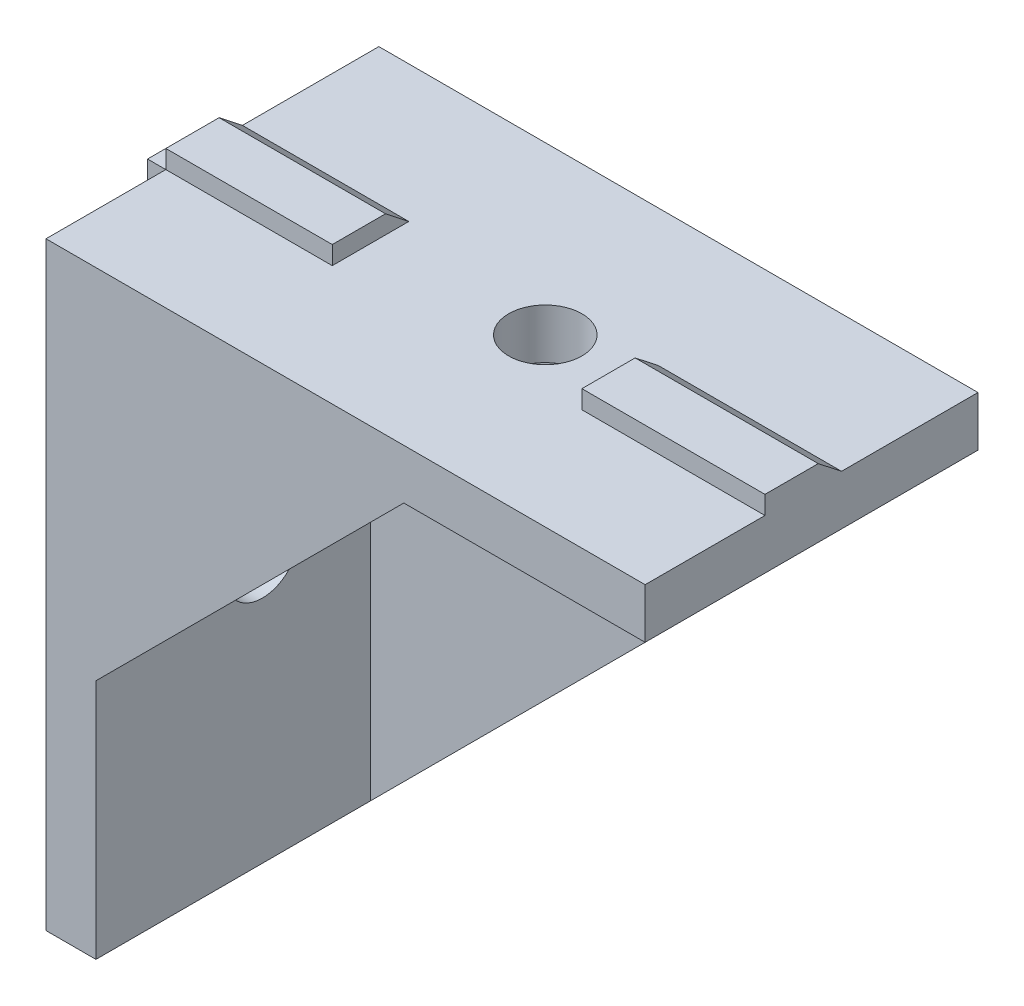
ISO-10303-21;
HEADER;
FILE_DESCRIPTION(('STEP AP214'),'2;1');
FILE_NAME('part.step','',(''),(''),'','','');
FILE_SCHEMA(('AUTOMOTIVE_DESIGN { 1 0 10303 214 1 1 1 1 }'));
ENDSEC;
DATA;
#1=APPLICATION_CONTEXT('core data for automotive mechanical design processes');
#2=APPLICATION_PROTOCOL_DEFINITION('international standard','automotive_design',2000,#1);
#3=PRODUCT_CONTEXT('',#1,'mechanical');
#4=PRODUCT('Part','Part','',(#3));
#5=PRODUCT_RELATED_PRODUCT_CATEGORY('part','',(#4));
#6=PRODUCT_DEFINITION_FORMATION('','',#4);
#7=PRODUCT_DEFINITION_CONTEXT('part definition',#1,'design');
#8=PRODUCT_DEFINITION('design','',#6,#7);
#9=PRODUCT_DEFINITION_SHAPE('','',#8);
#10=(LENGTH_UNIT() NAMED_UNIT(*) SI_UNIT(.MILLI.,.METRE.));
#11=(NAMED_UNIT(*) PLANE_ANGLE_UNIT() SI_UNIT($,.RADIAN.));
#12=(NAMED_UNIT(*) SI_UNIT($,.STERADIAN.) SOLID_ANGLE_UNIT());
#13=UNCERTAINTY_MEASURE_WITH_UNIT(LENGTH_MEASURE(1.E-05),#10,'distance_accuracy_value','');
#14=(GEOMETRIC_REPRESENTATION_CONTEXT(3) GLOBAL_UNCERTAINTY_ASSIGNED_CONTEXT((#13)) GLOBAL_UNIT_ASSIGNED_CONTEXT((#10,
#11,#12)) REPRESENTATION_CONTEXT('',''));
#15=CARTESIAN_POINT('',(0.,0.,0.));
#16=DIRECTION('',(0.,0.,1.));
#17=DIRECTION('',(1.,0.,0.));
#18=AXIS2_PLACEMENT_3D('',#15,#16,#17);
#19=CARTESIAN_POINT('',(3.,-3.,20.));
#20=DIRECTION('',(-1.,0.,0.));
#21=DIRECTION('',(0.,0.,1.));
#22=AXIS2_PLACEMENT_3D('',#19,#20,#21);
#23=PLANE('',#22);
#24=CARTESIAN_POINT('',(3.,-20.,10.));
#25=DIRECTION('',(1.,0.,0.));
#26=DIRECTION('',(0.,0.,-1.));
#27=AXIS2_PLACEMENT_3D('',#24,#25,#26);
#28=CIRCLE('',#27,2.2);
#29=CARTESIAN_POINT('',(3.,-20.,7.8));
#30=VERTEX_POINT('',#29);
#31=EDGE_CURVE('E282',#30,#30,#28,.T.);
#32=ORIENTED_EDGE('',*,*,#31,.F.);
#33=EDGE_LOOP('',(#32));
#34=FACE_BOUND('',#33,.T.);
#35=DIRECTION('',(0.,0.908676843963313,-0.417500171550712));
#36=VECTOR('',#35,1.);
#37=CARTESIAN_POINT('',(3.,-21.5,17.5));
#38=LINE('',#37,#36);
#39=CARTESIAN_POINT('',(3.,-21.5,17.5));
#40=VERTEX_POINT('',#39);
#41=CARTESIAN_POINT('',(3.,-3.,9.));
#42=VERTEX_POINT('',#41);
#43=EDGE_CURVE('E549',#40,#42,#38,.T.);
#44=ORIENTED_EDGE('',*,*,#43,.F.);
#45=DIRECTION('',(0.,0.,1.));
#46=VECTOR('',#45,1.);
#47=CARTESIAN_POINT('',(3.,-21.5,17.5));
#48=LINE('',#47,#46);
#49=CARTESIAN_POINT('',(3.,-21.5,20.));
#50=VERTEX_POINT('',#49);
#51=EDGE_CURVE('E583',#40,#50,#48,.T.);
#52=ORIENTED_EDGE('',*,*,#51,.T.);
#53=DIRECTION('',(0.,1.,0.));
#54=VECTOR('',#53,1.);
#55=CARTESIAN_POINT('',(3.,-3.,20.));
#56=LINE('',#55,#54);
#57=CARTESIAN_POINT('',(3.,-36.,20.));
#58=VERTEX_POINT('',#57);
#59=EDGE_CURVE('E591',#58,#50,#56,.T.);
#60=ORIENTED_EDGE('',*,*,#59,.F.);
#61=DIRECTION('',(0.,0.,-1.));
#62=VECTOR('',#61,1.);
#63=CARTESIAN_POINT('',(3.,-36.,20.));
#64=LINE('',#63,#62);
#65=CARTESIAN_POINT('',(3.,-36.,3.5));
#66=VERTEX_POINT('',#65);
#67=EDGE_CURVE('E240',#58,#66,#64,.T.);
#68=ORIENTED_EDGE('',*,*,#67,.T.);
#69=DIRECTION('',(0.,1.,0.));
#70=VECTOR('',#69,1.);
#71=CARTESIAN_POINT('',(3.,-3.,3.5));
#72=LINE('',#71,#70);
#73=CARTESIAN_POINT('',(3.,-3.,3.5));
#74=VERTEX_POINT('',#73);
#75=EDGE_CURVE('E228',#66,#74,#72,.T.);
#76=ORIENTED_EDGE('',*,*,#75,.T.);
#77=DIRECTION('',(0.,0.,-1.));
#78=VECTOR('',#77,1.);
#79=CARTESIAN_POINT('',(3.,-3.,20.));
#80=LINE('',#79,#78);
#81=EDGE_CURVE('E238',#42,#74,#80,.T.);
#82=ORIENTED_EDGE('',*,*,#81,.F.);
#83=EDGE_LOOP('',(#44,#52,#60,#68,#76,#82));
#84=FACE_BOUND('',#83,.T.);
#85=ADVANCED_FACE('F36',(#34,#84),#23,.F.);
#86=CARTESIAN_POINT('',(36.,-3.,20.));
#87=DIRECTION('',(0.,1.,0.));
#88=DIRECTION('',(0.,0.,1.));
#89=AXIS2_PLACEMENT_3D('',#86,#87,#88);
#90=PLANE('',#89);
#91=CARTESIAN_POINT('',(20.,-3.,10.));
#92=DIRECTION('',(0.,-1.,0.));
#93=DIRECTION('',(0.,0.,-1.));
#94=AXIS2_PLACEMENT_3D('',#91,#92,#93);
#95=CIRCLE('',#94,2.2);
#96=CARTESIAN_POINT('',(20.,-3.,7.8));
#97=VERTEX_POINT('',#96);
#98=EDGE_CURVE('E597',#97,#97,#95,.T.);
#99=ORIENTED_EDGE('',*,*,#98,.F.);
#100=EDGE_LOOP('',(#99));
#101=FACE_BOUND('',#100,.T.);
#102=DIRECTION('',(0.908676843963313,0.,0.417500171550712));
#103=VECTOR('',#102,1.);
#104=CARTESIAN_POINT('',(3.,-3.,9.));
#105=LINE('',#104,#103);
#106=CARTESIAN_POINT('',(21.5,-3.,17.5));
#107=VERTEX_POINT('',#106);
#108=EDGE_CURVE('E567',#42,#107,#105,.T.);
#109=ORIENTED_EDGE('',*,*,#108,.F.);
#110=ORIENTED_EDGE('',*,*,#81,.T.);
#111=DIRECTION('',(1.,0.,0.));
#112=VECTOR('',#111,1.);
#113=CARTESIAN_POINT('',(36.,-3.,3.5));
#114=LINE('',#113,#112);
#115=CARTESIAN_POINT('',(36.,-3.,3.5));
#116=VERTEX_POINT('',#115);
#117=EDGE_CURVE('E231',#74,#116,#114,.T.);
#118=ORIENTED_EDGE('',*,*,#117,.T.);
#119=DIRECTION('',(0.,0.,-1.));
#120=VECTOR('',#119,1.);
#121=CARTESIAN_POINT('',(36.,-3.,20.));
#122=LINE('',#121,#120);
#123=CARTESIAN_POINT('',(36.,-3.,20.));
#124=VERTEX_POINT('',#123);
#125=EDGE_CURVE('E206',#124,#116,#122,.T.);
#126=ORIENTED_EDGE('',*,*,#125,.F.);
#127=DIRECTION('',(1.,0.,0.));
#128=VECTOR('',#127,1.);
#129=CARTESIAN_POINT('',(36.,-3.,20.));
#130=LINE('',#129,#128);
#131=CARTESIAN_POINT('',(21.5,-3.,20.));
#132=VERTEX_POINT('',#131);
#133=EDGE_CURVE('E224',#132,#124,#130,.T.);
#134=ORIENTED_EDGE('',*,*,#133,.F.);
#135=DIRECTION('',(0.,0.,1.));
#136=VECTOR('',#135,1.);
#137=CARTESIAN_POINT('',(21.5,-3.,17.5));
#138=LINE('',#137,#136);
#139=EDGE_CURVE('E232',#107,#132,#138,.T.);
#140=ORIENTED_EDGE('',*,*,#139,.F.);
#141=EDGE_LOOP('',(#109,#110,#118,#126,#134,#140));
#142=FACE_BOUND('',#141,.T.);
#143=ADVANCED_FACE('F421',(#101,#142),#90,.F.);
#144=CARTESIAN_POINT('',(-1.1,4.72969343615419,9.6));
#145=DIRECTION('',(-0.786318338822423,0.,-0.617821551931904));
#146=DIRECTION('',(-0.617821551931904,0.,0.786318338822423));
#147=AXIS2_PLACEMENT_3D('',#144,#145,#146);
#148=PLANE('',#147);
#149=DIRECTION('',(-0.617821551931904,0.,0.786318338822423));
#150=VECTOR('',#149,1.);
#151=CARTESIAN_POINT('',(-1.1,-25.,9.6));
#152=LINE('',#151,#150);
#153=CARTESIAN_POINT('',(0.,-25.,8.19999999999999));
#154=VERTEX_POINT('',#153);
#155=CARTESIAN_POINT('',(-1.1,-25.,9.6));
#156=VERTEX_POINT('',#155);
#157=EDGE_CURVE('E558',#154,#156,#152,.T.);
#158=ORIENTED_EDGE('',*,*,#157,.F.);
#159=DIRECTION('',(0.,-1.,0.));
#160=VECTOR('',#159,1.);
#161=CARTESIAN_POINT('',(0.,4.72969343615419,8.2));
#162=LINE('',#161,#160);
#163=CARTESIAN_POINT('',(0.,-36.,8.2));
#164=VERTEX_POINT('',#163);
#165=EDGE_CURVE('E11',#154,#164,#162,.T.);
#166=ORIENTED_EDGE('',*,*,#165,.T.);
#167=DIRECTION('',(0.617821551931904,0.,-0.786318338822423));
#168=VECTOR('',#167,1.);
#169=CARTESIAN_POINT('',(-1.1,-36.,9.6));
#170=LINE('',#169,#168);
#171=CARTESIAN_POINT('',(-1.1,-36.,9.6));
#172=VERTEX_POINT('',#171);
#173=EDGE_CURVE('E385',#172,#164,#170,.T.);
#174=ORIENTED_EDGE('',*,*,#173,.F.);
#175=DIRECTION('',(0.,-1.,0.));
#176=VECTOR('',#175,1.);
#177=CARTESIAN_POINT('',(-1.1,4.72969343615419,9.6));
#178=LINE('',#177,#176);
#179=EDGE_CURVE('E389',#156,#172,#178,.T.);
#180=ORIENTED_EDGE('',*,*,#179,.F.);
#181=EDGE_LOOP('',(#158,#166,#174,#180));
#182=FACE_BOUND('',#181,.T.);
#183=ADVANCED_FACE('F411',(#182),#148,.T.);
#184=CARTESIAN_POINT('',(-1.1,4.72969343615419,12.8));
#185=DIRECTION('',(-1.,0.,0.));
#186=DIRECTION('',(0.,0.,1.));
#187=AXIS2_PLACEMENT_3D('',#184,#185,#186);
#188=PLANE('',#187);
#189=DIRECTION('',(0.,0.,1.));
#190=VECTOR('',#189,1.);
#191=CARTESIAN_POINT('',(-1.1,-25.,-2.50000000007189E-05));
#192=LINE('',#191,#190);
#193=CARTESIAN_POINT('',(-1.1,-25.,12.8));
#194=VERTEX_POINT('',#193);
#195=EDGE_CURVE('E409',#156,#194,#192,.T.);
#196=ORIENTED_EDGE('',*,*,#195,.F.);
#197=ORIENTED_EDGE('',*,*,#179,.T.);
#198=DIRECTION('',(0.,0.,-1.));
#199=VECTOR('',#198,1.);
#200=CARTESIAN_POINT('',(-1.1,-36.,12.8));
#201=LINE('',#200,#199);
#202=CARTESIAN_POINT('',(-1.1,-36.,12.8));
#203=VERTEX_POINT('',#202);
#204=EDGE_CURVE('E377',#203,#172,#201,.T.);
#205=ORIENTED_EDGE('',*,*,#204,.F.);
#206=DIRECTION('',(0.,-1.,0.));
#207=VECTOR('',#206,1.);
#208=CARTESIAN_POINT('',(-1.1,4.72969343615419,12.8));
#209=LINE('',#208,#207);
#210=EDGE_CURVE('E363',#194,#203,#209,.T.);
#211=ORIENTED_EDGE('',*,*,#210,.F.);
#212=EDGE_LOOP('',(#196,#197,#205,#211));
#213=FACE_BOUND('',#212,.T.);
#214=ADVANCED_FACE('F408',(#213),#188,.T.);
#215=CARTESIAN_POINT('',(0.,4.72969343615419,12.8));
#216=DIRECTION('',(0.,0.,1.));
#217=DIRECTION('',(1.,0.,0.));
#218=AXIS2_PLACEMENT_3D('',#215,#216,#217);
#219=PLANE('',#218);
#220=DIRECTION('',(1.,0.,0.));
#221=VECTOR('',#220,1.);
#222=CARTESIAN_POINT('',(0.,-25.,12.8));
#223=LINE('',#222,#221);
#224=CARTESIAN_POINT('',(0.,-25.,12.8));
#225=VERTEX_POINT('',#224);
#226=EDGE_CURVE('E407',#194,#225,#223,.T.);
#227=ORIENTED_EDGE('',*,*,#226,.F.);
#228=ORIENTED_EDGE('',*,*,#210,.T.);
#229=DIRECTION('',(-1.,0.,0.));
#230=VECTOR('',#229,1.);
#231=CARTESIAN_POINT('',(0.,-36.,12.8));
#232=LINE('',#231,#230);
#233=CARTESIAN_POINT('',(0.,-36.,12.8));
#234=VERTEX_POINT('',#233);
#235=EDGE_CURVE('E365',#234,#203,#232,.T.);
#236=ORIENTED_EDGE('',*,*,#235,.F.);
#237=DIRECTION('',(0.,-1.,0.));
#238=VECTOR('',#237,1.);
#239=CARTESIAN_POINT('',(0.,4.72969343615419,12.8));
#240=LINE('',#239,#238);
#241=EDGE_CURVE('E364',#225,#234,#240,.T.);
#242=ORIENTED_EDGE('',*,*,#241,.F.);
#243=EDGE_LOOP('',(#227,#228,#236,#242));
#244=FACE_BOUND('',#243,.T.);
#245=ADVANCED_FACE('F405',(#244),#219,.T.);
#246=CARTESIAN_POINT('',(0.,-36.,3.5));
#247=DIRECTION('',(1.,0.,0.));
#248=DIRECTION('',(0.,0.,-1.));
#249=AXIS2_PLACEMENT_3D('',#246,#247,#248);
#250=PLANE('',#249);
#251=DIRECTION('',(0.,0.,-1.));
#252=VECTOR('',#251,1.);
#253=CARTESIAN_POINT('',(0.,0.,8.2));
#254=LINE('',#253,#252);
#255=CARTESIAN_POINT('',(0.,0.,12.8));
#256=VERTEX_POINT('',#255);
#257=CARTESIAN_POINT('',(0.,0.,8.2));
#258=VERTEX_POINT('',#257);
#259=EDGE_CURVE('E340',#256,#258,#254,.T.);
#260=ORIENTED_EDGE('',*,*,#259,.F.);
#261=DIRECTION('',(0.,-1.,0.));
#262=VECTOR('',#261,1.);
#263=CARTESIAN_POINT('',(0.,0.,12.8));
#264=LINE('',#263,#262);
#265=CARTESIAN_POINT('',(0.,1.1,12.8));
#266=VERTEX_POINT('',#265);
#267=EDGE_CURVE('E285',#266,#256,#264,.T.);
#268=ORIENTED_EDGE('',*,*,#267,.F.);
#269=DIRECTION('',(0.,0.,1.));
#270=VECTOR('',#269,1.);
#271=CARTESIAN_POINT('',(0.,1.1,12.8));
#272=LINE('',#271,#270);
#273=CARTESIAN_POINT('',(0.,1.1,9.6));
#274=VERTEX_POINT('',#273);
#275=EDGE_CURVE('E289',#274,#266,#272,.T.);
#276=ORIENTED_EDGE('',*,*,#275,.F.);
#277=DIRECTION('',(0.,0.617821551931903,0.786318338822423));
#278=VECTOR('',#277,1.);
#279=CARTESIAN_POINT('',(0.,1.1,9.6));
#280=LINE('',#279,#278);
#281=EDGE_CURVE('E295',#258,#274,#280,.T.);
#282=ORIENTED_EDGE('',*,*,#281,.F.);
#283=EDGE_LOOP('',(#260,#268,#276,#282));
#284=FACE_BOUND('',#283,.T.);
#285=ADVANCED_FACE('F418',(#284),#250,.F.);
#286=CARTESIAN_POINT('',(0.,0.,12.8));
#287=DIRECTION('',(0.,0.,1.));
#288=DIRECTION('',(1.,0.,0.));
#289=AXIS2_PLACEMENT_3D('',#286,#287,#288);
#290=PLANE('',#289);
#291=DIRECTION('',(0.,1.,0.));
#292=VECTOR('',#291,1.);
#293=CARTESIAN_POINT('',(25.,1.1,12.8));
#294=LINE('',#293,#292);
#295=CARTESIAN_POINT('',(25.,0.,12.8));
#296=VERTEX_POINT('',#295);
#297=CARTESIAN_POINT('',(25.,1.1,12.8));
#298=VERTEX_POINT('',#297);
#299=EDGE_CURVE('E338',#296,#298,#294,.T.);
#300=ORIENTED_EDGE('',*,*,#299,.F.);
#301=DIRECTION('',(1.,0.,0.));
#302=VECTOR('',#301,1.);
#303=CARTESIAN_POINT('',(0.,0.,12.8));
#304=LINE('',#303,#302);
#305=CARTESIAN_POINT('',(36.,0.,12.8));
#306=VERTEX_POINT('',#305);
#307=EDGE_CURVE('E266',#296,#306,#304,.T.);
#308=ORIENTED_EDGE('',*,*,#307,.T.);
#309=DIRECTION('',(0.,-1.,0.));
#310=VECTOR('',#309,1.);
#311=CARTESIAN_POINT('',(36.,0.,12.8));
#312=LINE('',#311,#310);
#313=CARTESIAN_POINT('',(36.,1.1,12.8));
#314=VERTEX_POINT('',#313);
#315=EDGE_CURVE('E292',#314,#306,#312,.T.);
#316=ORIENTED_EDGE('',*,*,#315,.F.);
#317=DIRECTION('',(1.,0.,0.));
#318=VECTOR('',#317,1.);
#319=CARTESIAN_POINT('',(0.,1.1,12.8));
#320=LINE('',#319,#318);
#321=EDGE_CURVE('E497',#298,#314,#320,.T.);
#322=ORIENTED_EDGE('',*,*,#321,.F.);
#323=EDGE_LOOP('',(#300,#308,#316,#322));
#324=FACE_BOUND('',#323,.T.);
#325=ADVANCED_FACE('F496',(#324),#290,.T.);
#326=CARTESIAN_POINT('',(0.,1.1,12.8));
#327=DIRECTION('',(0.,1.,0.));
#328=DIRECTION('',(0.,0.,1.));
#329=AXIS2_PLACEMENT_3D('',#326,#327,#328);
#330=PLANE('',#329);
#331=DIRECTION('',(0.,0.,1.));
#332=VECTOR('',#331,1.);
#333=CARTESIAN_POINT('',(25.,1.1,-2.50000000007189E-05));
#334=LINE('',#333,#332);
#335=CARTESIAN_POINT('',(25.,1.1,9.6));
#336=VERTEX_POINT('',#335);
#337=EDGE_CURVE('E325',#336,#298,#334,.T.);
#338=ORIENTED_EDGE('',*,*,#337,.T.);
#339=ORIENTED_EDGE('',*,*,#321,.T.);
#340=DIRECTION('',(0.,0.,1.));
#341=VECTOR('',#340,1.);
#342=CARTESIAN_POINT('',(36.,1.1,12.8));
#343=LINE('',#342,#341);
#344=CARTESIAN_POINT('',(36.,1.1,9.6));
#345=VERTEX_POINT('',#344);
#346=EDGE_CURVE('E275',#345,#314,#343,.T.);
#347=ORIENTED_EDGE('',*,*,#346,.F.);
#348=DIRECTION('',(1.,0.,0.));
#349=VECTOR('',#348,1.);
#350=CARTESIAN_POINT('',(0.,1.1,9.6));
#351=LINE('',#350,#349);
#352=EDGE_CURVE('E311',#336,#345,#351,.T.);
#353=ORIENTED_EDGE('',*,*,#352,.F.);
#354=EDGE_LOOP('',(#338,#339,#347,#353));
#355=FACE_BOUND('',#354,.T.);
#356=ADVANCED_FACE('F513',(#355),#330,.T.);
#357=CARTESIAN_POINT('',(0.,1.1,9.6));
#358=DIRECTION('',(0.,0.786318338822423,-0.617821551931903));
#359=DIRECTION('',(0.,0.617821551931904,0.786318338822423));
#360=AXIS2_PLACEMENT_3D('',#357,#358,#359);
#361=PLANE('',#360);
#362=DIRECTION('',(0.,-0.617821551931904,-0.786318338822423));
#363=VECTOR('',#362,1.);
#364=CARTESIAN_POINT('',(25.,1.1,9.6));
#365=LINE('',#364,#363);
#366=CARTESIAN_POINT('',(25.,0.,8.2));
#367=VERTEX_POINT('',#366);
#368=EDGE_CURVE('E46',#336,#367,#365,.T.);
#369=ORIENTED_EDGE('',*,*,#368,.F.);
#370=ORIENTED_EDGE('',*,*,#352,.T.);
#371=DIRECTION('',(0.,0.617821551931903,0.786318338822423));
#372=VECTOR('',#371,1.);
#373=CARTESIAN_POINT('',(36.,1.1,9.6));
#374=LINE('',#373,#372);
#375=CARTESIAN_POINT('',(36.,0.,8.2));
#376=VERTEX_POINT('',#375);
#377=EDGE_CURVE('E335',#376,#345,#374,.T.);
#378=ORIENTED_EDGE('',*,*,#377,.F.);
#379=DIRECTION('',(1.,0.,0.));
#380=VECTOR('',#379,1.);
#381=CARTESIAN_POINT('',(0.,0.,8.2));
#382=LINE('',#381,#380);
#383=EDGE_CURVE('E298',#367,#376,#382,.T.);
#384=ORIENTED_EDGE('',*,*,#383,.F.);
#385=EDGE_LOOP('',(#369,#370,#378,#384));
#386=FACE_BOUND('',#385,.T.);
#387=ADVANCED_FACE('F442',(#386),#361,.T.);
#388=CARTESIAN_POINT('',(0.,0.,3.5));
#389=DIRECTION('',(0.,0.,-1.));
#390=DIRECTION('',(-1.,0.,0.));
#391=AXIS2_PLACEMENT_3D('',#388,#389,#390);
#392=PLANE('',#391);
#393=ORIENTED_EDGE('',*,*,#117,.F.);
#394=ORIENTED_EDGE('',*,*,#75,.F.);
#395=DIRECTION('',(0.707106781186547,0.707106781186547,0.));
#396=VECTOR('',#395,1.);
#397=CARTESIAN_POINT('',(36.,-3.,3.5));
#398=LINE('',#397,#396);
#399=EDGE_CURVE('E244',#66,#116,#398,.T.);
#400=ORIENTED_EDGE('',*,*,#399,.T.);
#401=EDGE_LOOP('',(#393,#394,#400));
#402=FACE_BOUND('',#401,.T.);
#403=ADVANCED_FACE('F439',(#402),#392,.F.);
#404=CARTESIAN_POINT('',(3.,-36.,3.5));
#405=DIRECTION('',(0.,1.,0.));
#406=DIRECTION('',(0.,0.,1.));
#407=AXIS2_PLACEMENT_3D('',#404,#405,#406);
#408=PLANE('',#407);
#409=DIRECTION('',(1.,0.,0.));
#410=VECTOR('',#409,1.);
#411=CARTESIAN_POINT('',(3.,-36.,0.));
#412=LINE('',#411,#410);
#413=CARTESIAN_POINT('',(0.,-36.,0.));
#414=VERTEX_POINT('',#413);
#415=CARTESIAN_POINT('',(3.,-36.,0.));
#416=VERTEX_POINT('',#415);
#417=EDGE_CURVE('E243',#414,#416,#412,.T.);
#418=ORIENTED_EDGE('',*,*,#417,.T.);
#419=DIRECTION('',(0.,0.,-1.));
#420=VECTOR('',#419,1.);
#421=CARTESIAN_POINT('',(3.,-36.,3.5));
#422=LINE('',#421,#420);
#423=EDGE_CURVE('E301',#66,#416,#422,.T.);
#424=ORIENTED_EDGE('',*,*,#423,.F.);
#425=ORIENTED_EDGE('',*,*,#67,.F.);
#426=DIRECTION('',(1.,0.,0.));
#427=VECTOR('',#426,1.);
#428=CARTESIAN_POINT('',(3.,-36.,20.));
#429=LINE('',#428,#427);
#430=CARTESIAN_POINT('',(0.,-36.,20.));
#431=VERTEX_POINT('',#430);
#432=EDGE_CURVE('E235',#431,#58,#429,.T.);
#433=ORIENTED_EDGE('',*,*,#432,.F.);
#434=DIRECTION('',(0.,0.,-1.));
#435=VECTOR('',#434,1.);
#436=CARTESIAN_POINT('',(0.,-36.,3.5));
#437=LINE('',#436,#435);
#438=EDGE_CURVE('E61',#431,#234,#437,.T.);
#439=ORIENTED_EDGE('',*,*,#438,.T.);
#440=ORIENTED_EDGE('',*,*,#235,.T.);
#441=ORIENTED_EDGE('',*,*,#204,.T.);
#442=ORIENTED_EDGE('',*,*,#173,.T.);
#443=EDGE_CURVE('E246',#164,#414,#437,.T.);
#444=ORIENTED_EDGE('',*,*,#443,.T.);
#445=EDGE_LOOP('',(#418,#424,#425,#433,#439,#440,#441,#442,#444));
#446=FACE_BOUND('',#445,.T.);
#447=ADVANCED_FACE('F38',(#446),#408,.F.);
#448=CARTESIAN_POINT('',(36.,-3.,3.5));
#449=DIRECTION('',(-0.707106781186548,0.707106781186548,0.));
#450=DIRECTION('',(-0.707106781186548,-0.707106781186548,0.));
#451=AXIS2_PLACEMENT_3D('',#448,#449,#450);
#452=PLANE('',#451);
#453=DIRECTION('',(0.707106781186547,0.707106781186547,0.));
#454=VECTOR('',#453,1.);
#455=CARTESIAN_POINT('',(36.,-3.,0.));
#456=LINE('',#455,#454);
#457=CARTESIAN_POINT('',(36.,-3.,0.));
#458=VERTEX_POINT('',#457);
#459=EDGE_CURVE('E250',#416,#458,#456,.T.);
#460=ORIENTED_EDGE('',*,*,#459,.T.);
#461=DIRECTION('',(0.,0.,-1.));
#462=VECTOR('',#461,1.);
#463=CARTESIAN_POINT('',(36.,-3.,3.5));
#464=LINE('',#463,#462);
#465=EDGE_CURVE('E466',#116,#458,#464,.T.);
#466=ORIENTED_EDGE('',*,*,#465,.F.);
#467=ORIENTED_EDGE('',*,*,#399,.F.);
#468=ORIENTED_EDGE('',*,*,#423,.T.);
#469=EDGE_LOOP('',(#460,#466,#467,#468));
#470=FACE_BOUND('',#469,.T.);
#471=ADVANCED_FACE('F455',(#470),#452,.F.);
#472=CARTESIAN_POINT('',(36.,0.,3.5));
#473=DIRECTION('',(-1.,0.,0.));
#474=DIRECTION('',(0.,0.,1.));
#475=AXIS2_PLACEMENT_3D('',#472,#473,#474);
#476=PLANE('',#475);
#477=DIRECTION('',(0.,1.,0.));
#478=VECTOR('',#477,1.);
#479=CARTESIAN_POINT('',(36.,0.,0.));
#480=LINE('',#479,#478);
#481=CARTESIAN_POINT('',(36.,0.,0.));
#482=VERTEX_POINT('',#481);
#483=EDGE_CURVE('E252',#458,#482,#480,.T.);
#484=ORIENTED_EDGE('',*,*,#483,.T.);
#485=DIRECTION('',(0.,0.,-1.));
#486=VECTOR('',#485,1.);
#487=CARTESIAN_POINT('',(36.,0.,3.5));
#488=LINE('',#487,#486);
#489=EDGE_CURVE('E217',#376,#482,#488,.T.);
#490=ORIENTED_EDGE('',*,*,#489,.F.);
#491=ORIENTED_EDGE('',*,*,#377,.T.);
#492=ORIENTED_EDGE('',*,*,#346,.T.);
#493=ORIENTED_EDGE('',*,*,#315,.T.);
#494=CARTESIAN_POINT('',(36.,0.,20.));
#495=VERTEX_POINT('',#494);
#496=EDGE_CURVE('E473',#495,#306,#488,.T.);
#497=ORIENTED_EDGE('',*,*,#496,.F.);
#498=DIRECTION('',(0.,1.,0.));
#499=VECTOR('',#498,1.);
#500=CARTESIAN_POINT('',(36.,0.,20.));
#501=LINE('',#500,#499);
#502=EDGE_CURVE('E222',#124,#495,#501,.T.);
#503=ORIENTED_EDGE('',*,*,#502,.F.);
#504=ORIENTED_EDGE('',*,*,#125,.T.);
#505=ORIENTED_EDGE('',*,*,#465,.T.);
#506=EDGE_LOOP('',(#484,#490,#491,#492,#493,#497,#503,#504,#505));
#507=FACE_BOUND('',#506,.T.);
#508=ADVANCED_FACE('F453',(#507),#476,.F.);
#509=CARTESIAN_POINT('',(0.,0.,3.5));
#510=DIRECTION('',(0.,-1.,0.));
#511=DIRECTION('',(0.,0.,-1.));
#512=AXIS2_PLACEMENT_3D('',#509,#510,#511);
#513=PLANE('',#512);
#514=DIRECTION('',(0.,0.,-1.));
#515=VECTOR('',#514,1.);
#516=CARTESIAN_POINT('',(0.,0.,3.5));
#517=LINE('',#516,#515);
#518=CARTESIAN_POINT('',(0.,0.,20.));
#519=VERTEX_POINT('',#518);
#520=EDGE_CURVE('E40',#519,#256,#517,.T.);
#521=ORIENTED_EDGE('',*,*,#520,.F.);
#522=DIRECTION('',(-1.,0.,0.));
#523=VECTOR('',#522,1.);
#524=CARTESIAN_POINT('',(0.,0.,20.));
#525=LINE('',#524,#523);
#526=EDGE_CURVE('E207',#495,#519,#525,.T.);
#527=ORIENTED_EDGE('',*,*,#526,.F.);
#528=ORIENTED_EDGE('',*,*,#496,.T.);
#529=ORIENTED_EDGE('',*,*,#307,.F.);
#530=DIRECTION('',(0.,0.,1.));
#531=VECTOR('',#530,1.);
#532=CARTESIAN_POINT('',(25.,0.,-2.50000000007189E-05));
#533=LINE('',#532,#531);
#534=EDGE_CURVE('E333',#367,#296,#533,.T.);
#535=ORIENTED_EDGE('',*,*,#534,.F.);
#536=ORIENTED_EDGE('',*,*,#383,.T.);
#537=ORIENTED_EDGE('',*,*,#489,.T.);
#538=DIRECTION('',(-1.,0.,0.));
#539=VECTOR('',#538,1.);
#540=CARTESIAN_POINT('',(0.,0.,0.));
#541=LINE('',#540,#539);
#542=CARTESIAN_POINT('',(0.,0.,0.));
#543=VERTEX_POINT('',#542);
#544=EDGE_CURVE('E255',#482,#543,#541,.T.);
#545=ORIENTED_EDGE('',*,*,#544,.T.);
#546=EDGE_CURVE('E218',#258,#543,#517,.T.);
#547=ORIENTED_EDGE('',*,*,#546,.F.);
#548=CARTESIAN_POINT('',(10.,0.,8.2));
#549=VERTEX_POINT('',#548);
#550=EDGE_CURVE('E288',#258,#549,#382,.T.);
#551=ORIENTED_EDGE('',*,*,#550,.T.);
#552=DIRECTION('',(0.,0.,1.));
#553=VECTOR('',#552,1.);
#554=CARTESIAN_POINT('',(10.,0.,-2.50000000007189E-05));
#555=LINE('',#554,#553);
#556=CARTESIAN_POINT('',(10.,0.,12.8));
#557=VERTEX_POINT('',#556);
#558=EDGE_CURVE('E331',#549,#557,#555,.T.);
#559=ORIENTED_EDGE('',*,*,#558,.T.);
#560=EDGE_CURVE('E215',#256,#557,#304,.T.);
#561=ORIENTED_EDGE('',*,*,#560,.F.);
#562=EDGE_LOOP('',(#521,#527,#528,#529,#535,#536,#537,#545,#547,#551,#559,#561));
#563=FACE_BOUND('',#562,.T.);
#564=CARTESIAN_POINT('',(20.,0.,10.));
#565=DIRECTION('',(0.,-1.,0.));
#566=DIRECTION('',(0.,0.,-1.));
#567=AXIS2_PLACEMENT_3D('',#564,#565,#566);
#568=CIRCLE('',#567,2.2);
#569=CARTESIAN_POINT('',(20.,0.,7.8));
#570=VERTEX_POINT('',#569);
#571=EDGE_CURVE('E595',#570,#570,#568,.T.);
#572=ORIENTED_EDGE('',*,*,#571,.T.);
#573=EDGE_LOOP('',(#572));
#574=FACE_BOUND('',#573,.T.);
#575=ADVANCED_FACE('F212',(#563,#574),#513,.F.);
#576=CARTESIAN_POINT('',(0.,-20.,10.));
#577=DIRECTION('',(1.,0.,0.));
#578=DIRECTION('',(0.,0.,-1.));
#579=AXIS2_PLACEMENT_3D('',#576,#577,#578);
#580=CIRCLE('',#579,2.2);
#581=CARTESIAN_POINT('',(0.,-20.,7.8));
#582=VERTEX_POINT('',#581);
#583=EDGE_CURVE('E305',#582,#582,#580,.T.);
#584=ORIENTED_EDGE('',*,*,#583,.T.);
#585=EDGE_LOOP('',(#584));
#586=FACE_BOUND('',#585,.T.);
#587=ORIENTED_EDGE('',*,*,#241,.T.);
#588=ORIENTED_EDGE('',*,*,#438,.F.);
#589=DIRECTION('',(0.,-1.,0.));
#590=VECTOR('',#589,1.);
#591=CARTESIAN_POINT('',(0.,-36.,20.));
#592=LINE('',#591,#590);
#593=EDGE_CURVE('E198',#519,#431,#592,.T.);
#594=ORIENTED_EDGE('',*,*,#593,.F.);
#595=ORIENTED_EDGE('',*,*,#520,.T.);
#596=CARTESIAN_POINT('',(0.,-10.,12.8));
#597=VERTEX_POINT('',#596);
#598=EDGE_CURVE('E361',#256,#597,#240,.T.);
#599=ORIENTED_EDGE('',*,*,#598,.T.);
#600=DIRECTION('',(0.,0.,1.));
#601=VECTOR('',#600,1.);
#602=CARTESIAN_POINT('',(0.,-10.,-2.50000000007189E-05));
#603=LINE('',#602,#601);
#604=CARTESIAN_POINT('',(0.,-10.,8.2));
#605=VERTEX_POINT('',#604);
#606=EDGE_CURVE('E53',#605,#597,#603,.T.);
#607=ORIENTED_EDGE('',*,*,#606,.F.);
#608=EDGE_CURVE('E350',#258,#605,#162,.T.);
#609=ORIENTED_EDGE('',*,*,#608,.F.);
#610=ORIENTED_EDGE('',*,*,#546,.T.);
#611=DIRECTION('',(0.,-1.,0.));
#612=VECTOR('',#611,1.);
#613=CARTESIAN_POINT('',(0.,-36.,0.));
#614=LINE('',#613,#612);
#615=EDGE_CURVE('E247',#543,#414,#614,.T.);
#616=ORIENTED_EDGE('',*,*,#615,.T.);
#617=ORIENTED_EDGE('',*,*,#443,.F.);
#618=ORIENTED_EDGE('',*,*,#165,.F.);
#619=DIRECTION('',(0.,0.,1.));
#620=VECTOR('',#619,1.);
#621=CARTESIAN_POINT('',(0.,-25.,-2.50000000007189E-05));
#622=LINE('',#621,#620);
#623=EDGE_CURVE('E559',#154,#225,#622,.T.);
#624=ORIENTED_EDGE('',*,*,#623,.T.);
#625=EDGE_LOOP('',(#587,#588,#594,#595,#599,#607,#609,#610,#616,#617,#618,#624));
#626=FACE_BOUND('',#625,.T.);
#627=ADVANCED_FACE('F200',(#586,#626),#250,.F.);
#628=CARTESIAN_POINT('',(0.,0.,0.));
#629=DIRECTION('',(0.,0.,-1.));
#630=DIRECTION('',(-1.,0.,0.));
#631=AXIS2_PLACEMENT_3D('',#628,#629,#630);
#632=PLANE('',#631);
#633=ORIENTED_EDGE('',*,*,#417,.F.);
#634=ORIENTED_EDGE('',*,*,#615,.F.);
#635=ORIENTED_EDGE('',*,*,#544,.F.);
#636=ORIENTED_EDGE('',*,*,#483,.F.);
#637=ORIENTED_EDGE('',*,*,#459,.F.);
#638=EDGE_LOOP('',(#633,#634,#635,#636,#637));
#639=FACE_BOUND('',#638,.T.);
#640=ADVANCED_FACE('F444',(#639),#632,.T.);
#641=CARTESIAN_POINT('',(0.,0.,20.));
#642=DIRECTION('',(0.,0.,-1.));
#643=DIRECTION('',(-1.,0.,0.));
#644=AXIS2_PLACEMENT_3D('',#641,#642,#643);
#645=PLANE('',#644);
#646=ORIENTED_EDGE('',*,*,#526,.T.);
#647=ORIENTED_EDGE('',*,*,#593,.T.);
#648=ORIENTED_EDGE('',*,*,#432,.T.);
#649=ORIENTED_EDGE('',*,*,#59,.T.);
#650=DIRECTION('',(0.707106781186548,0.707106781186548,0.));
#651=VECTOR('',#650,1.);
#652=CARTESIAN_POINT('',(3.,-21.5,20.));
#653=LINE('',#652,#651);
#654=EDGE_CURVE('E584',#50,#132,#653,.T.);
#655=ORIENTED_EDGE('',*,*,#654,.T.);
#656=ORIENTED_EDGE('',*,*,#133,.T.);
#657=ORIENTED_EDGE('',*,*,#502,.T.);
#658=EDGE_LOOP('',(#646,#647,#648,#649,#655,#656,#657));
#659=FACE_BOUND('',#658,.T.);
#660=ADVANCED_FACE('F220',(#659),#645,.F.);
#661=CARTESIAN_POINT('',(3.,-21.5,17.5));
#662=DIRECTION('',(0.707106781186548,-0.707106781186548,0.));
#663=DIRECTION('',(0.707106781186548,0.707106781186548,0.));
#664=AXIS2_PLACEMENT_3D('',#661,#662,#663);
#665=PLANE('',#664);
#666=ORIENTED_EDGE('',*,*,#654,.F.);
#667=ORIENTED_EDGE('',*,*,#51,.F.);
#668=DIRECTION('',(0.707106781186548,0.707106781186548,0.));
#669=VECTOR('',#668,1.);
#670=CARTESIAN_POINT('',(3.,-21.5,17.5));
#671=LINE('',#670,#669);
#672=EDGE_CURVE('E572',#40,#107,#671,.T.);
#673=ORIENTED_EDGE('',*,*,#672,.T.);
#674=ORIENTED_EDGE('',*,*,#139,.T.);
#675=EDGE_LOOP('',(#666,#667,#673,#674));
#676=FACE_BOUND('',#675,.T.);
#677=ADVANCED_FACE('F580',(#676),#665,.T.);
#678=CARTESIAN_POINT('',(20.,0.,10.));
#679=DIRECTION('',(0.,-1.,0.));
#680=DIRECTION('',(0.,0.,-1.));
#681=AXIS2_PLACEMENT_3D('',#678,#679,#680);
#682=CYLINDRICAL_SURFACE('',#681,2.2);
#683=ORIENTED_EDGE('',*,*,#571,.F.);
#684=EDGE_LOOP('',(#683));
#685=FACE_BOUND('',#684,.T.);
#686=ORIENTED_EDGE('',*,*,#98,.T.);
#687=EDGE_LOOP('',(#686));
#688=FACE_BOUND('',#687,.T.);
#689=ADVANCED_FACE('F532',(#685,#688),#682,.F.);
#690=CARTESIAN_POINT('',(0.,-20.,10.));
#691=DIRECTION('',(1.,0.,0.));
#692=DIRECTION('',(0.,0.,-1.));
#693=AXIS2_PLACEMENT_3D('',#690,#691,#692);
#694=CYLINDRICAL_SURFACE('',#693,2.2);
#695=ORIENTED_EDGE('',*,*,#583,.F.);
#696=EDGE_LOOP('',(#695));
#697=FACE_BOUND('',#696,.T.);
#698=ORIENTED_EDGE('',*,*,#31,.T.);
#699=EDGE_LOOP('',(#698));
#700=FACE_BOUND('',#699,.T.);
#701=ADVANCED_FACE('F528',(#697,#700),#694,.F.);
#702=DIRECTION('',(0.,-1.,0.));
#703=VECTOR('',#702,1.);
#704=CARTESIAN_POINT('',(10.,1.1,12.8));
#705=LINE('',#704,#703);
#706=CARTESIAN_POINT('',(10.,1.1,12.8));
#707=VERTEX_POINT('',#706);
#708=EDGE_CURVE('E329',#707,#557,#705,.T.);
#709=ORIENTED_EDGE('',*,*,#708,.F.);
#710=EDGE_CURVE('E270',#266,#707,#320,.T.);
#711=ORIENTED_EDGE('',*,*,#710,.F.);
#712=ORIENTED_EDGE('',*,*,#267,.T.);
#713=ORIENTED_EDGE('',*,*,#560,.T.);
#714=EDGE_LOOP('',(#709,#711,#712,#713));
#715=FACE_BOUND('',#714,.T.);
#716=ADVANCED_FACE('F509',(#715),#290,.T.);
#717=DIRECTION('',(0.,0.,1.));
#718=VECTOR('',#717,1.);
#719=CARTESIAN_POINT('',(10.,1.1,-2.50000000007189E-05));
#720=LINE('',#719,#718);
#721=CARTESIAN_POINT('',(10.,1.1,9.6));
#722=VERTEX_POINT('',#721);
#723=EDGE_CURVE('E328',#722,#707,#720,.T.);
#724=ORIENTED_EDGE('',*,*,#723,.F.);
#725=EDGE_CURVE('E304',#274,#722,#351,.T.);
#726=ORIENTED_EDGE('',*,*,#725,.F.);
#727=ORIENTED_EDGE('',*,*,#275,.T.);
#728=ORIENTED_EDGE('',*,*,#710,.T.);
#729=EDGE_LOOP('',(#724,#726,#727,#728));
#730=FACE_BOUND('',#729,.T.);
#731=ADVANCED_FACE('F506',(#730),#330,.T.);
#732=DIRECTION('',(0.,0.617821551931904,0.786318338822423));
#733=VECTOR('',#732,1.);
#734=CARTESIAN_POINT('',(10.,1.1,9.6));
#735=LINE('',#734,#733);
#736=EDGE_CURVE('E300',#549,#722,#735,.T.);
#737=ORIENTED_EDGE('',*,*,#736,.F.);
#738=ORIENTED_EDGE('',*,*,#550,.F.);
#739=ORIENTED_EDGE('',*,*,#281,.T.);
#740=ORIENTED_EDGE('',*,*,#725,.T.);
#741=EDGE_LOOP('',(#737,#738,#739,#740));
#742=FACE_BOUND('',#741,.T.);
#743=ADVANCED_FACE('F521',(#742),#361,.T.);
#744=CARTESIAN_POINT('',(25.,1.1,-2.50000000007189E-05));
#745=DIRECTION('',(1.,0.,0.));
#746=DIRECTION('',(0.,0.,-1.));
#747=AXIS2_PLACEMENT_3D('',#744,#745,#746);
#748=PLANE('',#747);
#749=ORIENTED_EDGE('',*,*,#368,.T.);
#750=ORIENTED_EDGE('',*,*,#534,.T.);
#751=ORIENTED_EDGE('',*,*,#299,.T.);
#752=ORIENTED_EDGE('',*,*,#337,.F.);
#753=EDGE_LOOP('',(#749,#750,#751,#752));
#754=FACE_BOUND('',#753,.T.);
#755=ADVANCED_FACE('F512',(#754),#748,.F.);
#756=CARTESIAN_POINT('',(10.,1.1,-2.50000000007189E-05));
#757=DIRECTION('',(-1.,0.,0.));
#758=DIRECTION('',(0.,0.,1.));
#759=AXIS2_PLACEMENT_3D('',#756,#757,#758);
#760=PLANE('',#759);
#761=ORIENTED_EDGE('',*,*,#736,.T.);
#762=ORIENTED_EDGE('',*,*,#723,.T.);
#763=ORIENTED_EDGE('',*,*,#708,.T.);
#764=ORIENTED_EDGE('',*,*,#558,.F.);
#765=EDGE_LOOP('',(#761,#762,#763,#764));
#766=FACE_BOUND('',#765,.T.);
#767=ADVANCED_FACE('F511',(#766),#760,.F.);
#768=DIRECTION('',(0.617821551931904,0.,-0.786318338822423));
#769=VECTOR('',#768,1.);
#770=CARTESIAN_POINT('',(-1.1,-10.,9.6));
#771=LINE('',#770,#769);
#772=CARTESIAN_POINT('',(-1.1,-10.,9.6));
#773=VERTEX_POINT('',#772);
#774=EDGE_CURVE('E557',#773,#605,#771,.T.);
#775=ORIENTED_EDGE('',*,*,#774,.F.);
#776=CARTESIAN_POINT('',(-1.1,0.,9.6));
#777=VERTEX_POINT('',#776);
#778=EDGE_CURVE('E358',#777,#773,#178,.T.);
#779=ORIENTED_EDGE('',*,*,#778,.F.);
#780=DIRECTION('',(-0.617821551931904,0.,0.786318338822423));
#781=VECTOR('',#780,1.);
#782=CARTESIAN_POINT('',(-1.1,0.,9.6));
#783=LINE('',#782,#781);
#784=EDGE_CURVE('E349',#258,#777,#783,.T.);
#785=ORIENTED_EDGE('',*,*,#784,.F.);
#786=ORIENTED_EDGE('',*,*,#608,.T.);
#787=EDGE_LOOP('',(#775,#779,#785,#786));
#788=FACE_BOUND('',#787,.T.);
#789=ADVANCED_FACE('F424',(#788),#148,.T.);
#790=DIRECTION('',(0.,0.,1.));
#791=VECTOR('',#790,1.);
#792=CARTESIAN_POINT('',(-1.1,-10.,-2.50000000007189E-05));
#793=LINE('',#792,#791);
#794=CARTESIAN_POINT('',(-1.1,-10.,12.8));
#795=VERTEX_POINT('',#794);
#796=EDGE_CURVE('E551',#773,#795,#793,.T.);
#797=ORIENTED_EDGE('',*,*,#796,.T.);
#798=CARTESIAN_POINT('',(-1.1,0.,12.8));
#799=VERTEX_POINT('',#798);
#800=EDGE_CURVE('E369',#799,#795,#209,.T.);
#801=ORIENTED_EDGE('',*,*,#800,.F.);
#802=DIRECTION('',(0.,0.,1.));
#803=VECTOR('',#802,1.);
#804=CARTESIAN_POINT('',(-1.1,0.,12.8));
#805=LINE('',#804,#803);
#806=EDGE_CURVE('E353',#777,#799,#805,.T.);
#807=ORIENTED_EDGE('',*,*,#806,.F.);
#808=ORIENTED_EDGE('',*,*,#778,.T.);
#809=EDGE_LOOP('',(#797,#801,#807,#808));
#810=FACE_BOUND('',#809,.T.);
#811=ADVANCED_FACE('F413',(#810),#188,.T.);
#812=DIRECTION('',(-1.,0.,0.));
#813=VECTOR('',#812,1.);
#814=CARTESIAN_POINT('',(0.,-10.,12.8));
#815=LINE('',#814,#813);
#816=EDGE_CURVE('E548',#597,#795,#815,.T.);
#817=ORIENTED_EDGE('',*,*,#816,.F.);
#818=ORIENTED_EDGE('',*,*,#598,.F.);
#819=DIRECTION('',(1.,0.,0.));
#820=VECTOR('',#819,1.);
#821=CARTESIAN_POINT('',(0.,0.,12.8));
#822=LINE('',#821,#820);
#823=EDGE_CURVE('E356',#799,#256,#822,.T.);
#824=ORIENTED_EDGE('',*,*,#823,.F.);
#825=ORIENTED_EDGE('',*,*,#800,.T.);
#826=EDGE_LOOP('',(#817,#818,#824,#825));
#827=FACE_BOUND('',#826,.T.);
#828=ADVANCED_FACE('F420',(#827),#219,.T.);
#829=CARTESIAN_POINT('',(0.,0.,3.5));
#830=DIRECTION('',(0.,-1.,0.));
#831=DIRECTION('',(0.,0.,-1.));
#832=AXIS2_PLACEMENT_3D('',#829,#830,#831);
#833=PLANE('',#832);
#834=ORIENTED_EDGE('',*,*,#784,.T.);
#835=ORIENTED_EDGE('',*,*,#806,.T.);
#836=ORIENTED_EDGE('',*,*,#823,.T.);
#837=ORIENTED_EDGE('',*,*,#259,.T.);
#838=EDGE_LOOP('',(#834,#835,#836,#837));
#839=FACE_BOUND('',#838,.T.);
#840=ADVANCED_FACE('F541',(#839),#833,.F.);
#841=CARTESIAN_POINT('',(0.,-25.,-2.50000000007189E-05));
#842=DIRECTION('',(0.,-1.,0.));
#843=DIRECTION('',(0.,0.,-1.));
#844=AXIS2_PLACEMENT_3D('',#841,#842,#843);
#845=PLANE('',#844);
#846=ORIENTED_EDGE('',*,*,#157,.T.);
#847=ORIENTED_EDGE('',*,*,#195,.T.);
#848=ORIENTED_EDGE('',*,*,#226,.T.);
#849=ORIENTED_EDGE('',*,*,#623,.F.);
#850=EDGE_LOOP('',(#846,#847,#848,#849));
#851=FACE_BOUND('',#850,.T.);
#852=ADVANCED_FACE('F545',(#851),#845,.F.);
#853=CARTESIAN_POINT('',(0.,-10.,-2.50000000007189E-05));
#854=DIRECTION('',(0.,1.,0.));
#855=DIRECTION('',(0.,0.,1.));
#856=AXIS2_PLACEMENT_3D('',#853,#854,#855);
#857=PLANE('',#856);
#858=ORIENTED_EDGE('',*,*,#774,.T.);
#859=ORIENTED_EDGE('',*,*,#606,.T.);
#860=ORIENTED_EDGE('',*,*,#816,.T.);
#861=ORIENTED_EDGE('',*,*,#796,.F.);
#862=EDGE_LOOP('',(#858,#859,#860,#861));
#863=FACE_BOUND('',#862,.T.);
#864=ADVANCED_FACE('F639',(#863),#857,.F.);
#865=CARTESIAN_POINT('',(-2.01694915254237,2.01694915254237,4.38983050847458));
#866=DIRECTION('',(-0.385270667734436,0.385270667734436,0.838530276833772));
#867=DIRECTION('',(0.908676843963312,0.,0.417500171550712));
#868=AXIS2_PLACEMENT_3D('',#865,#866,#867);
#869=PLANE('',#868);
#870=ORIENTED_EDGE('',*,*,#108,.T.);
#871=ORIENTED_EDGE('',*,*,#672,.F.);
#872=ORIENTED_EDGE('',*,*,#43,.T.);
#873=EDGE_LOOP('',(#870,#871,#872));
#874=FACE_BOUND('',#873,.T.);
#875=ADVANCED_FACE('F571',(#874),#869,.F.);
#876=CLOSED_SHELL('',(#85,#143,#183,#214,#245,#285,#325,#356,#387,#403,#447,#471,#508,#575,#627,
#640,#660,#677,#689,#701,#716,#731,#743,#755,#767,#789,#811,#828,#840,#852,#864,#875));
#877=MANIFOLD_SOLID_BREP('B2',#876);
#878=ADVANCED_BREP_SHAPE_REPRESENTATION('',(#18,#877),#14);
#879=SHAPE_DEFINITION_REPRESENTATION(#9,#878);
ENDSEC;
END-ISO-10303-21;
